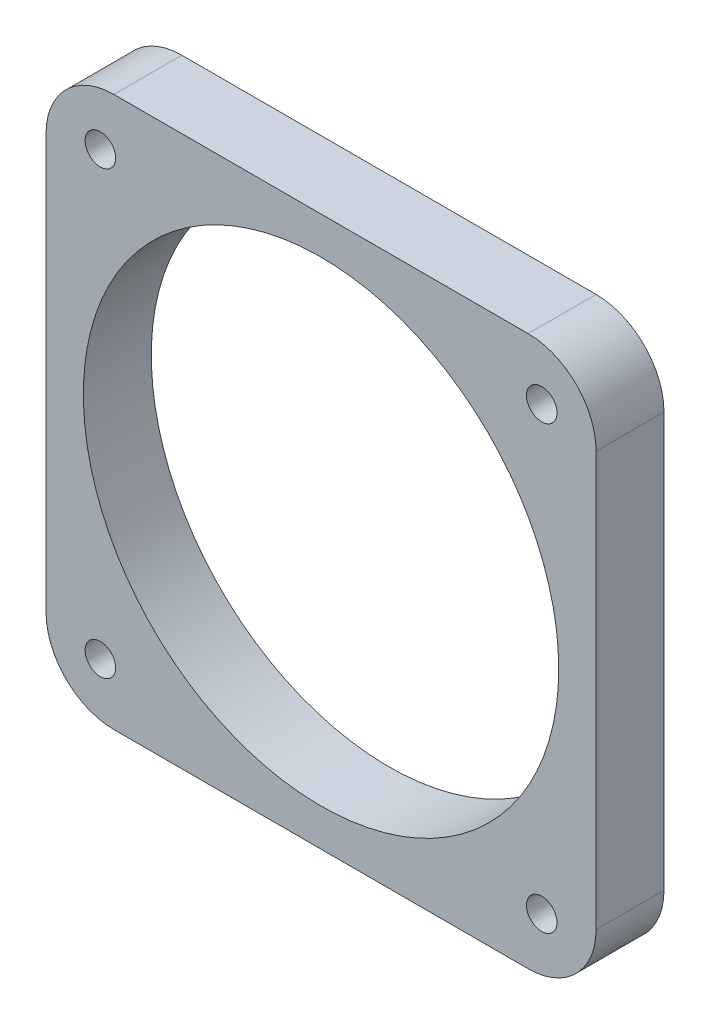
ISO-10303-21;
HEADER;
FILE_DESCRIPTION(('STEP AP214'),'2;1');
FILE_NAME('part.step','',(''),(''),'','','');
FILE_SCHEMA(('AUTOMOTIVE_DESIGN { 1 0 10303 214 1 1 1 1 }'));
ENDSEC;
DATA;
#1=APPLICATION_CONTEXT('core data for automotive mechanical design processes');
#2=APPLICATION_PROTOCOL_DEFINITION('international standard','automotive_design',2000,#1);
#3=PRODUCT_CONTEXT('',#1,'mechanical');
#4=PRODUCT('Part','Part','',(#3));
#5=PRODUCT_RELATED_PRODUCT_CATEGORY('part','',(#4));
#6=PRODUCT_DEFINITION_FORMATION('','',#4);
#7=PRODUCT_DEFINITION_CONTEXT('part definition',#1,'design');
#8=PRODUCT_DEFINITION('design','',#6,#7);
#9=PRODUCT_DEFINITION_SHAPE('','',#8);
#10=(LENGTH_UNIT() NAMED_UNIT(*) SI_UNIT(.MILLI.,.METRE.));
#11=(NAMED_UNIT(*) PLANE_ANGLE_UNIT() SI_UNIT($,.RADIAN.));
#12=(NAMED_UNIT(*) SI_UNIT($,.STERADIAN.) SOLID_ANGLE_UNIT());
#13=UNCERTAINTY_MEASURE_WITH_UNIT(LENGTH_MEASURE(1.E-05),#10,'distance_accuracy_value','');
#14=(GEOMETRIC_REPRESENTATION_CONTEXT(3) GLOBAL_UNCERTAINTY_ASSIGNED_CONTEXT((#13)) GLOBAL_UNIT_ASSIGNED_CONTEXT((#10,
#11,#12)) REPRESENTATION_CONTEXT('',''));
#15=CARTESIAN_POINT('',(0.,0.,0.));
#16=DIRECTION('',(0.,0.,1.));
#17=DIRECTION('',(1.,0.,0.));
#18=AXIS2_PLACEMENT_3D('',#15,#16,#17);
#19=CARTESIAN_POINT('',(-61.,-61.,20.));
#20=DIRECTION('',(0.,0.,-1.));
#21=DIRECTION('',(-1.,0.,0.));
#22=AXIS2_PLACEMENT_3D('',#19,#20,#21);
#23=PLANE('',#22);
#24=CARTESIAN_POINT('',(-61.,-61.,20.));
#25=DIRECTION('',(0.,0.,1.));
#26=DIRECTION('',(-1.,0.,0.));
#27=AXIS2_PLACEMENT_3D('',#24,#25,#26);
#28=CIRCLE('',#27,20.);
#29=CARTESIAN_POINT('',(-81.,-60.9999999999999,20.));
#30=VERTEX_POINT('',#29);
#31=CARTESIAN_POINT('',(-60.9999999999999,-81.,20.));
#32=VERTEX_POINT('',#31);
#33=EDGE_CURVE('E151',#30,#32,#28,.T.);
#34=ORIENTED_EDGE('',*,*,#33,.T.);
#35=DIRECTION('',(1.,0.,0.));
#36=VECTOR('',#35,1.);
#37=CARTESIAN_POINT('',(-60.9999999999999,-81.,20.));
#38=LINE('',#37,#36);
#39=CARTESIAN_POINT('',(60.9999999999998,-81.,20.));
#40=VERTEX_POINT('',#39);
#41=EDGE_CURVE('E99',#32,#40,#38,.T.);
#42=ORIENTED_EDGE('',*,*,#41,.T.);
#43=CARTESIAN_POINT('',(61.,-61.,20.));
#44=DIRECTION('',(0.,0.,1.));
#45=DIRECTION('',(1.,0.,0.));
#46=AXIS2_PLACEMENT_3D('',#43,#44,#45);
#47=CIRCLE('',#46,20.);
#48=CARTESIAN_POINT('',(81.,-61.,20.));
#49=VERTEX_POINT('',#48);
#50=EDGE_CURVE('E166',#40,#49,#47,.T.);
#51=ORIENTED_EDGE('',*,*,#50,.T.);
#52=DIRECTION('',(0.,1.,0.));
#53=VECTOR('',#52,1.);
#54=CARTESIAN_POINT('',(81.,-60.9999999999999,20.));
#55=LINE('',#54,#53);
#56=CARTESIAN_POINT('',(81.,60.9999999999999,20.));
#57=VERTEX_POINT('',#56);
#58=EDGE_CURVE('E179',#49,#57,#55,.T.);
#59=ORIENTED_EDGE('',*,*,#58,.T.);
#60=CARTESIAN_POINT('',(61.,61.,20.));
#61=DIRECTION('',(0.,0.,1.));
#62=DIRECTION('',(-1.,0.,0.));
#63=AXIS2_PLACEMENT_3D('',#60,#61,#62);
#64=CIRCLE('',#63,20.);
#65=CARTESIAN_POINT('',(60.9999999999998,81.,20.));
#66=VERTEX_POINT('',#65);
#67=EDGE_CURVE('E118',#57,#66,#64,.T.);
#68=ORIENTED_EDGE('',*,*,#67,.T.);
#69=DIRECTION('',(-1.,0.,0.));
#70=VECTOR('',#69,1.);
#71=CARTESIAN_POINT('',(-60.9999999999999,81.,20.));
#72=LINE('',#71,#70);
#73=CARTESIAN_POINT('',(-60.9999999999999,81.,20.));
#74=VERTEX_POINT('',#73);
#75=EDGE_CURVE('E112',#66,#74,#72,.T.);
#76=ORIENTED_EDGE('',*,*,#75,.T.);
#77=CARTESIAN_POINT('',(-61.,61.,20.));
#78=DIRECTION('',(0.,0.,1.));
#79=DIRECTION('',(-1.,0.,0.));
#80=AXIS2_PLACEMENT_3D('',#77,#78,#79);
#81=CIRCLE('',#80,20.);
#82=CARTESIAN_POINT('',(-81.,60.9999999999999,20.));
#83=VERTEX_POINT('',#82);
#84=EDGE_CURVE('E116',#74,#83,#81,.T.);
#85=ORIENTED_EDGE('',*,*,#84,.T.);
#86=DIRECTION('',(0.,-1.,0.));
#87=VECTOR('',#86,1.);
#88=CARTESIAN_POINT('',(-81.,-60.9999999999999,20.));
#89=LINE('',#88,#87);
#90=EDGE_CURVE('E56',#83,#30,#89,.T.);
#91=ORIENTED_EDGE('',*,*,#90,.T.);
#92=EDGE_LOOP('',(#34,#42,#51,#59,#68,#76,#85,#91));
#93=FACE_BOUND('',#92,.T.);
#94=CARTESIAN_POINT('',(-65.,65.,20.));
#95=DIRECTION('',(0.,0.,1.));
#96=DIRECTION('',(1.,0.,0.));
#97=AXIS2_PLACEMENT_3D('',#94,#95,#96);
#98=CIRCLE('',#97,4.5);
#99=CARTESIAN_POINT('',(-60.5,65.,20.));
#100=VERTEX_POINT('',#99);
#101=EDGE_CURVE('E140',#100,#100,#98,.T.);
#102=ORIENTED_EDGE('',*,*,#101,.F.);
#103=EDGE_LOOP('',(#102));
#104=FACE_BOUND('',#103,.T.);
#105=CARTESIAN_POINT('',(65.,65.,20.));
#106=DIRECTION('',(0.,0.,1.));
#107=DIRECTION('',(1.,0.,0.));
#108=AXIS2_PLACEMENT_3D('',#105,#106,#107);
#109=CIRCLE('',#108,4.50000000000001);
#110=CARTESIAN_POINT('',(69.5,65.,20.));
#111=VERTEX_POINT('',#110);
#112=EDGE_CURVE('E188',#111,#111,#109,.T.);
#113=ORIENTED_EDGE('',*,*,#112,.F.);
#114=EDGE_LOOP('',(#113));
#115=FACE_BOUND('',#114,.T.);
#116=CARTESIAN_POINT('',(65.,-65.,20.));
#117=DIRECTION('',(0.,0.,1.));
#118=DIRECTION('',(1.,0.,0.));
#119=AXIS2_PLACEMENT_3D('',#116,#117,#118);
#120=CIRCLE('',#119,4.50000000000001);
#121=CARTESIAN_POINT('',(69.5,-65.,20.));
#122=VERTEX_POINT('',#121);
#123=EDGE_CURVE('E194',#122,#122,#120,.T.);
#124=ORIENTED_EDGE('',*,*,#123,.F.);
#125=EDGE_LOOP('',(#124));
#126=FACE_BOUND('',#125,.T.);
#127=CARTESIAN_POINT('',(-65.,-65.,20.));
#128=DIRECTION('',(0.,0.,1.));
#129=DIRECTION('',(1.,0.,0.));
#130=AXIS2_PLACEMENT_3D('',#127,#128,#129);
#131=CIRCLE('',#130,4.50000000000001);
#132=CARTESIAN_POINT('',(-60.5,-65.,20.));
#133=VERTEX_POINT('',#132);
#134=EDGE_CURVE('E200',#133,#133,#131,.T.);
#135=ORIENTED_EDGE('',*,*,#134,.F.);
#136=EDGE_LOOP('',(#135));
#137=FACE_BOUND('',#136,.T.);
#138=CARTESIAN_POINT('',(0.,0.,20.));
#139=DIRECTION('',(0.,0.,1.));
#140=DIRECTION('',(1.,0.,0.));
#141=AXIS2_PLACEMENT_3D('',#138,#139,#140);
#142=CIRCLE('',#141,70.);
#143=CARTESIAN_POINT('',(70.,0.,20.));
#144=VERTEX_POINT('',#143);
#145=EDGE_CURVE('E206',#144,#144,#142,.T.);
#146=ORIENTED_EDGE('',*,*,#145,.F.);
#147=EDGE_LOOP('',(#146));
#148=FACE_BOUND('',#147,.T.);
#149=ADVANCED_FACE('F39',(#93,#104,#115,#126,#137,#148),#23,.F.);
#150=CARTESIAN_POINT('',(-61.,-61.,0.));
#151=DIRECTION('',(0.,0.,-1.));
#152=DIRECTION('',(-1.,0.,0.));
#153=AXIS2_PLACEMENT_3D('',#150,#151,#152);
#154=PLANE('',#153);
#155=CARTESIAN_POINT('',(-65.,-65.,0.));
#156=DIRECTION('',(0.,0.,1.));
#157=DIRECTION('',(1.,0.,0.));
#158=AXIS2_PLACEMENT_3D('',#155,#156,#157);
#159=CIRCLE('',#158,4.50000000000001);
#160=CARTESIAN_POINT('',(-60.5,-65.,0.));
#161=VERTEX_POINT('',#160);
#162=EDGE_CURVE('E203',#161,#161,#159,.T.);
#163=ORIENTED_EDGE('',*,*,#162,.T.);
#164=EDGE_LOOP('',(#163));
#165=FACE_BOUND('',#164,.T.);
#166=CARTESIAN_POINT('',(65.,65.,0.));
#167=DIRECTION('',(0.,0.,1.));
#168=DIRECTION('',(1.,0.,0.));
#169=AXIS2_PLACEMENT_3D('',#166,#167,#168);
#170=CIRCLE('',#169,4.50000000000001);
#171=CARTESIAN_POINT('',(69.5,65.,0.));
#172=VERTEX_POINT('',#171);
#173=EDGE_CURVE('E191',#172,#172,#170,.T.);
#174=ORIENTED_EDGE('',*,*,#173,.T.);
#175=EDGE_LOOP('',(#174));
#176=FACE_BOUND('',#175,.T.);
#177=CARTESIAN_POINT('',(-61.,-61.,0.));
#178=DIRECTION('',(0.,0.,1.));
#179=DIRECTION('',(-1.,0.,0.));
#180=AXIS2_PLACEMENT_3D('',#177,#178,#179);
#181=CIRCLE('',#180,20.);
#182=CARTESIAN_POINT('',(-81.,-60.9999999999999,0.));
#183=VERTEX_POINT('',#182);
#184=CARTESIAN_POINT('',(-60.9999999999999,-81.,0.));
#185=VERTEX_POINT('',#184);
#186=EDGE_CURVE('E136',#183,#185,#181,.T.);
#187=ORIENTED_EDGE('',*,*,#186,.F.);
#188=DIRECTION('',(0.,-1.,0.));
#189=VECTOR('',#188,1.);
#190=CARTESIAN_POINT('',(-81.,-60.9999999999999,0.));
#191=LINE('',#190,#189);
#192=CARTESIAN_POINT('',(-81.,60.9999999999999,0.));
#193=VERTEX_POINT('',#192);
#194=EDGE_CURVE('E91',#193,#183,#191,.T.);
#195=ORIENTED_EDGE('',*,*,#194,.F.);
#196=CARTESIAN_POINT('',(-61.,61.,0.));
#197=DIRECTION('',(0.,0.,1.));
#198=DIRECTION('',(-1.,0.,0.));
#199=AXIS2_PLACEMENT_3D('',#196,#197,#198);
#200=CIRCLE('',#199,20.);
#201=CARTESIAN_POINT('',(-60.9999999999999,81.,0.));
#202=VERTEX_POINT('',#201);
#203=EDGE_CURVE('E85',#202,#193,#200,.T.);
#204=ORIENTED_EDGE('',*,*,#203,.F.);
#205=DIRECTION('',(-1.,0.,0.));
#206=VECTOR('',#205,1.);
#207=CARTESIAN_POINT('',(-60.9999999999999,81.,0.));
#208=LINE('',#207,#206);
#209=CARTESIAN_POINT('',(60.9999999999998,81.,0.));
#210=VERTEX_POINT('',#209);
#211=EDGE_CURVE('E126',#210,#202,#208,.T.);
#212=ORIENTED_EDGE('',*,*,#211,.F.);
#213=CARTESIAN_POINT('',(61.,61.,0.));
#214=DIRECTION('',(0.,0.,1.));
#215=DIRECTION('',(-1.,0.,0.));
#216=AXIS2_PLACEMENT_3D('',#213,#214,#215);
#217=CIRCLE('',#216,20.);
#218=CARTESIAN_POINT('',(81.,60.9999999999999,0.));
#219=VERTEX_POINT('',#218);
#220=EDGE_CURVE('E146',#219,#210,#217,.T.);
#221=ORIENTED_EDGE('',*,*,#220,.F.);
#222=DIRECTION('',(0.,1.,0.));
#223=VECTOR('',#222,1.);
#224=CARTESIAN_POINT('',(81.,-60.9999999999999,0.));
#225=LINE('',#224,#223);
#226=CARTESIAN_POINT('',(81.,-61.,0.));
#227=VERTEX_POINT('',#226);
#228=EDGE_CURVE('E144',#227,#219,#225,.T.);
#229=ORIENTED_EDGE('',*,*,#228,.F.);
#230=CARTESIAN_POINT('',(61.,-61.,0.));
#231=DIRECTION('',(0.,0.,1.));
#232=DIRECTION('',(1.,0.,0.));
#233=AXIS2_PLACEMENT_3D('',#230,#231,#232);
#234=CIRCLE('',#233,20.);
#235=CARTESIAN_POINT('',(60.9999999999998,-81.,0.));
#236=VERTEX_POINT('',#235);
#237=EDGE_CURVE('E142',#236,#227,#234,.T.);
#238=ORIENTED_EDGE('',*,*,#237,.F.);
#239=DIRECTION('',(1.,0.,0.));
#240=VECTOR('',#239,1.);
#241=CARTESIAN_POINT('',(-60.9999999999999,-81.,0.));
#242=LINE('',#241,#240);
#243=EDGE_CURVE('E139',#185,#236,#242,.T.);
#244=ORIENTED_EDGE('',*,*,#243,.F.);
#245=EDGE_LOOP('',(#187,#195,#204,#212,#221,#229,#238,#244));
#246=FACE_BOUND('',#245,.T.);
#247=CARTESIAN_POINT('',(-65.,65.,0.));
#248=DIRECTION('',(0.,0.,1.));
#249=DIRECTION('',(1.,0.,0.));
#250=AXIS2_PLACEMENT_3D('',#247,#248,#249);
#251=CIRCLE('',#250,4.5);
#252=CARTESIAN_POINT('',(-60.5,65.,0.));
#253=VERTEX_POINT('',#252);
#254=EDGE_CURVE('E185',#253,#253,#251,.T.);
#255=ORIENTED_EDGE('',*,*,#254,.T.);
#256=EDGE_LOOP('',(#255));
#257=FACE_BOUND('',#256,.T.);
#258=CARTESIAN_POINT('',(65.,-65.,0.));
#259=DIRECTION('',(0.,0.,1.));
#260=DIRECTION('',(1.,0.,0.));
#261=AXIS2_PLACEMENT_3D('',#258,#259,#260);
#262=CIRCLE('',#261,4.50000000000001);
#263=CARTESIAN_POINT('',(69.5,-65.,0.));
#264=VERTEX_POINT('',#263);
#265=EDGE_CURVE('E197',#264,#264,#262,.T.);
#266=ORIENTED_EDGE('',*,*,#265,.T.);
#267=EDGE_LOOP('',(#266));
#268=FACE_BOUND('',#267,.T.);
#269=CARTESIAN_POINT('',(0.,0.,0.));
#270=DIRECTION('',(0.,0.,1.));
#271=DIRECTION('',(1.,0.,0.));
#272=AXIS2_PLACEMENT_3D('',#269,#270,#271);
#273=CIRCLE('',#272,70.);
#274=CARTESIAN_POINT('',(70.,0.,0.));
#275=VERTEX_POINT('',#274);
#276=EDGE_CURVE('E209',#275,#275,#273,.T.);
#277=ORIENTED_EDGE('',*,*,#276,.T.);
#278=EDGE_LOOP('',(#277));
#279=FACE_BOUND('',#278,.T.);
#280=ADVANCED_FACE('F170',(#165,#176,#246,#257,#268,#279),#154,.T.);
#281=CARTESIAN_POINT('',(-61.,-61.,20.));
#282=DIRECTION('',(0.,0.,-1.));
#283=DIRECTION('',(-1.,0.,0.));
#284=AXIS2_PLACEMENT_3D('',#281,#282,#283);
#285=CYLINDRICAL_SURFACE('',#284,20.);
#286=ORIENTED_EDGE('',*,*,#186,.T.);
#287=DIRECTION('',(0.,0.,-1.));
#288=VECTOR('',#287,1.);
#289=CARTESIAN_POINT('',(-60.9999999999999,-81.,20.));
#290=LINE('',#289,#288);
#291=EDGE_CURVE('E11',#32,#185,#290,.T.);
#292=ORIENTED_EDGE('',*,*,#291,.F.);
#293=ORIENTED_EDGE('',*,*,#33,.F.);
#294=DIRECTION('',(0.,0.,-1.));
#295=VECTOR('',#294,1.);
#296=CARTESIAN_POINT('',(-81.,-60.9999999999999,20.));
#297=LINE('',#296,#295);
#298=EDGE_CURVE('E132',#30,#183,#297,.T.);
#299=ORIENTED_EDGE('',*,*,#298,.T.);
#300=EDGE_LOOP('',(#286,#292,#293,#299));
#301=FACE_BOUND('',#300,.T.);
#302=ADVANCED_FACE('F41',(#301),#285,.T.);
#303=CARTESIAN_POINT('',(-60.9999999999999,-81.,20.));
#304=DIRECTION('',(0.,1.,0.));
#305=DIRECTION('',(0.,0.,1.));
#306=AXIS2_PLACEMENT_3D('',#303,#304,#305);
#307=PLANE('',#306);
#308=ORIENTED_EDGE('',*,*,#243,.T.);
#309=DIRECTION('',(0.,0.,-1.));
#310=VECTOR('',#309,1.);
#311=CARTESIAN_POINT('',(60.9999999999998,-81.,20.));
#312=LINE('',#311,#310);
#313=EDGE_CURVE('E48',#40,#236,#312,.T.);
#314=ORIENTED_EDGE('',*,*,#313,.F.);
#315=ORIENTED_EDGE('',*,*,#41,.F.);
#316=ORIENTED_EDGE('',*,*,#291,.T.);
#317=EDGE_LOOP('',(#308,#314,#315,#316));
#318=FACE_BOUND('',#317,.T.);
#319=ADVANCED_FACE('F241',(#318),#307,.F.);
#320=CARTESIAN_POINT('',(61.,-61.,20.));
#321=DIRECTION('',(0.,0.,-1.));
#322=DIRECTION('',(-1.,0.,0.));
#323=AXIS2_PLACEMENT_3D('',#320,#321,#322);
#324=CYLINDRICAL_SURFACE('',#323,20.);
#325=ORIENTED_EDGE('',*,*,#237,.T.);
#326=DIRECTION('',(0.,0.,-1.));
#327=VECTOR('',#326,1.);
#328=CARTESIAN_POINT('',(81.,-61.,20.));
#329=LINE('',#328,#327);
#330=EDGE_CURVE('E158',#49,#227,#329,.T.);
#331=ORIENTED_EDGE('',*,*,#330,.F.);
#332=ORIENTED_EDGE('',*,*,#50,.F.);
#333=ORIENTED_EDGE('',*,*,#313,.T.);
#334=EDGE_LOOP('',(#325,#331,#332,#333));
#335=FACE_BOUND('',#334,.T.);
#336=ADVANCED_FACE('F164',(#335),#324,.T.);
#337=CARTESIAN_POINT('',(81.,-60.9999999999999,20.));
#338=DIRECTION('',(-1.,0.,0.));
#339=DIRECTION('',(0.,0.,1.));
#340=AXIS2_PLACEMENT_3D('',#337,#338,#339);
#341=PLANE('',#340);
#342=ORIENTED_EDGE('',*,*,#228,.T.);
#343=DIRECTION('',(0.,0.,-1.));
#344=VECTOR('',#343,1.);
#345=CARTESIAN_POINT('',(81.,60.9999999999999,20.));
#346=LINE('',#345,#344);
#347=EDGE_CURVE('E155',#57,#219,#346,.T.);
#348=ORIENTED_EDGE('',*,*,#347,.F.);
#349=ORIENTED_EDGE('',*,*,#58,.F.);
#350=ORIENTED_EDGE('',*,*,#330,.T.);
#351=EDGE_LOOP('',(#342,#348,#349,#350));
#352=FACE_BOUND('',#351,.T.);
#353=ADVANCED_FACE('F175',(#352),#341,.F.);
#354=CARTESIAN_POINT('',(61.,61.,20.));
#355=DIRECTION('',(0.,0.,-1.));
#356=DIRECTION('',(-1.,0.,0.));
#357=AXIS2_PLACEMENT_3D('',#354,#355,#356);
#358=CYLINDRICAL_SURFACE('',#357,20.);
#359=ORIENTED_EDGE('',*,*,#220,.T.);
#360=DIRECTION('',(0.,0.,-1.));
#361=VECTOR('',#360,1.);
#362=CARTESIAN_POINT('',(60.9999999999998,81.,20.));
#363=LINE('',#362,#361);
#364=EDGE_CURVE('E127',#66,#210,#363,.T.);
#365=ORIENTED_EDGE('',*,*,#364,.F.);
#366=ORIENTED_EDGE('',*,*,#67,.F.);
#367=ORIENTED_EDGE('',*,*,#347,.T.);
#368=EDGE_LOOP('',(#359,#365,#366,#367));
#369=FACE_BOUND('',#368,.T.);
#370=ADVANCED_FACE('F178',(#369),#358,.T.);
#371=CARTESIAN_POINT('',(-60.9999999999999,81.,20.));
#372=DIRECTION('',(0.,-1.,0.));
#373=DIRECTION('',(0.,0.,-1.));
#374=AXIS2_PLACEMENT_3D('',#371,#372,#373);
#375=PLANE('',#374);
#376=ORIENTED_EDGE('',*,*,#211,.T.);
#377=DIRECTION('',(0.,0.,-1.));
#378=VECTOR('',#377,1.);
#379=CARTESIAN_POINT('',(-60.9999999999999,81.,20.));
#380=LINE('',#379,#378);
#381=EDGE_CURVE('E123',#74,#202,#380,.T.);
#382=ORIENTED_EDGE('',*,*,#381,.F.);
#383=ORIENTED_EDGE('',*,*,#75,.F.);
#384=ORIENTED_EDGE('',*,*,#364,.T.);
#385=EDGE_LOOP('',(#376,#382,#383,#384));
#386=FACE_BOUND('',#385,.T.);
#387=ADVANCED_FACE('F124',(#386),#375,.F.);
#388=CARTESIAN_POINT('',(-61.,61.,20.));
#389=DIRECTION('',(0.,0.,-1.));
#390=DIRECTION('',(-1.,0.,0.));
#391=AXIS2_PLACEMENT_3D('',#388,#389,#390);
#392=CYLINDRICAL_SURFACE('',#391,20.);
#393=ORIENTED_EDGE('',*,*,#203,.T.);
#394=DIRECTION('',(0.,0.,-1.));
#395=VECTOR('',#394,1.);
#396=CARTESIAN_POINT('',(-81.,60.9999999999999,20.));
#397=LINE('',#396,#395);
#398=EDGE_CURVE('E128',#83,#193,#397,.T.);
#399=ORIENTED_EDGE('',*,*,#398,.F.);
#400=ORIENTED_EDGE('',*,*,#84,.F.);
#401=ORIENTED_EDGE('',*,*,#381,.T.);
#402=EDGE_LOOP('',(#393,#399,#400,#401));
#403=FACE_BOUND('',#402,.T.);
#404=ADVANCED_FACE('F130',(#403),#392,.T.);
#405=CARTESIAN_POINT('',(-81.,-60.9999999999999,20.));
#406=DIRECTION('',(1.,0.,0.));
#407=DIRECTION('',(0.,0.,-1.));
#408=AXIS2_PLACEMENT_3D('',#405,#406,#407);
#409=PLANE('',#408);
#410=ORIENTED_EDGE('',*,*,#194,.T.);
#411=ORIENTED_EDGE('',*,*,#298,.F.);
#412=ORIENTED_EDGE('',*,*,#90,.F.);
#413=ORIENTED_EDGE('',*,*,#398,.T.);
#414=EDGE_LOOP('',(#410,#411,#412,#413));
#415=FACE_BOUND('',#414,.T.);
#416=ADVANCED_FACE('F229',(#415),#409,.F.);
#417=CARTESIAN_POINT('',(-65.,65.,20.));
#418=DIRECTION('',(0.,0.,-1.));
#419=DIRECTION('',(-1.,0.,0.));
#420=AXIS2_PLACEMENT_3D('',#417,#418,#419);
#421=CYLINDRICAL_SURFACE('',#420,4.5);
#422=ORIENTED_EDGE('',*,*,#101,.T.);
#423=EDGE_LOOP('',(#422));
#424=FACE_BOUND('',#423,.T.);
#425=ORIENTED_EDGE('',*,*,#254,.F.);
#426=EDGE_LOOP('',(#425));
#427=FACE_BOUND('',#426,.T.);
#428=ADVANCED_FACE('F226',(#424,#427),#421,.F.);
#429=CARTESIAN_POINT('',(65.,65.,20.));
#430=DIRECTION('',(0.,0.,-1.));
#431=DIRECTION('',(-1.,0.,0.));
#432=AXIS2_PLACEMENT_3D('',#429,#430,#431);
#433=CYLINDRICAL_SURFACE('',#432,4.50000000000001);
#434=ORIENTED_EDGE('',*,*,#112,.T.);
#435=EDGE_LOOP('',(#434));
#436=FACE_BOUND('',#435,.T.);
#437=ORIENTED_EDGE('',*,*,#173,.F.);
#438=EDGE_LOOP('',(#437));
#439=FACE_BOUND('',#438,.T.);
#440=ADVANCED_FACE('F304',(#436,#439),#433,.F.);
#441=CARTESIAN_POINT('',(65.,-65.,20.));
#442=DIRECTION('',(0.,0.,-1.));
#443=DIRECTION('',(-1.,0.,0.));
#444=AXIS2_PLACEMENT_3D('',#441,#442,#443);
#445=CYLINDRICAL_SURFACE('',#444,4.50000000000001);
#446=ORIENTED_EDGE('',*,*,#123,.T.);
#447=EDGE_LOOP('',(#446));
#448=FACE_BOUND('',#447,.T.);
#449=ORIENTED_EDGE('',*,*,#265,.F.);
#450=EDGE_LOOP('',(#449));
#451=FACE_BOUND('',#450,.T.);
#452=ADVANCED_FACE('F312',(#448,#451),#445,.F.);
#453=CARTESIAN_POINT('',(-65.,-65.,20.));
#454=DIRECTION('',(0.,0.,-1.));
#455=DIRECTION('',(-1.,0.,0.));
#456=AXIS2_PLACEMENT_3D('',#453,#454,#455);
#457=CYLINDRICAL_SURFACE('',#456,4.50000000000001);
#458=ORIENTED_EDGE('',*,*,#134,.T.);
#459=EDGE_LOOP('',(#458));
#460=FACE_BOUND('',#459,.T.);
#461=ORIENTED_EDGE('',*,*,#162,.F.);
#462=EDGE_LOOP('',(#461));
#463=FACE_BOUND('',#462,.T.);
#464=ADVANCED_FACE('F320',(#460,#463),#457,.F.);
#465=CARTESIAN_POINT('',(0.,0.,20.));
#466=DIRECTION('',(0.,0.,-1.));
#467=DIRECTION('',(-1.,0.,0.));
#468=AXIS2_PLACEMENT_3D('',#465,#466,#467);
#469=CYLINDRICAL_SURFACE('',#468,70.);
#470=ORIENTED_EDGE('',*,*,#145,.T.);
#471=EDGE_LOOP('',(#470));
#472=FACE_BOUND('',#471,.T.);
#473=ORIENTED_EDGE('',*,*,#276,.F.);
#474=EDGE_LOOP('',(#473));
#475=FACE_BOUND('',#474,.T.);
#476=ADVANCED_FACE('F215',(#472,#475),#469,.F.);
#477=CLOSED_SHELL('',(#149,#280,#302,#319,#336,#353,#370,#387,#404,#416,#428,#440,#452,#464,#476));
#478=MANIFOLD_SOLID_BREP('B2',#477);
#479=ADVANCED_BREP_SHAPE_REPRESENTATION('',(#18,#478),#14);
#480=SHAPE_DEFINITION_REPRESENTATION(#9,#479);
ENDSEC;
END-ISO-10303-21;
